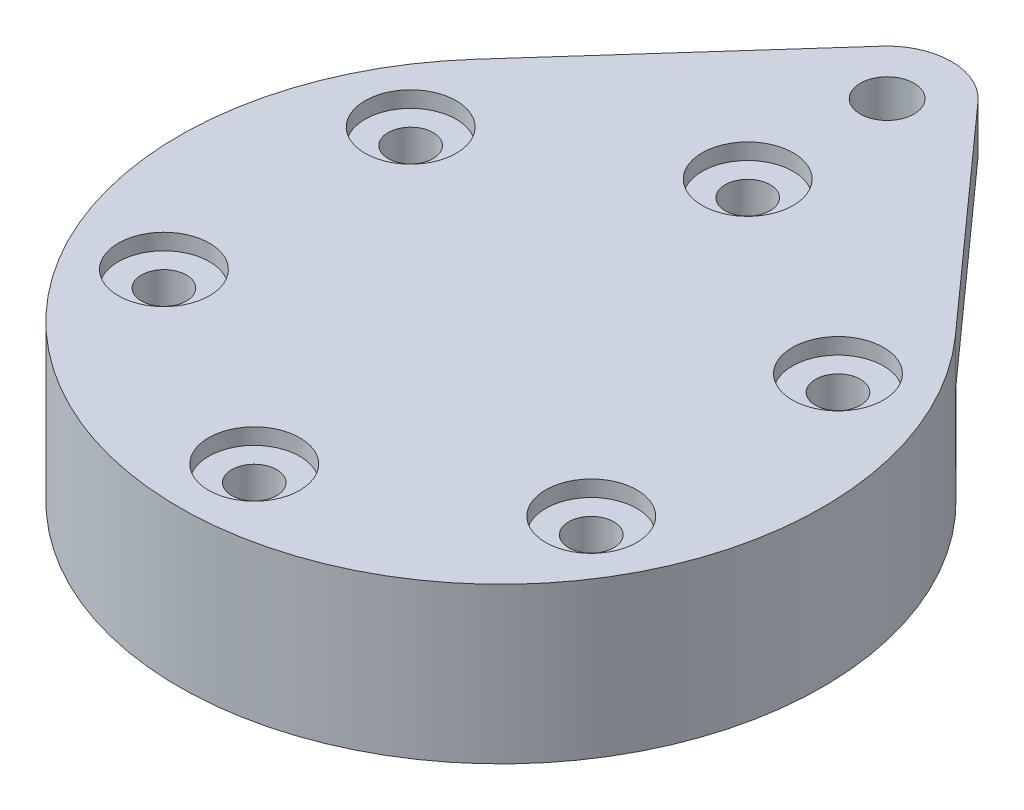
ISO-10303-21;
HEADER;
FILE_DESCRIPTION(('STEP AP214'),'2;1');
FILE_NAME('part.step','',(''),(''),'','','');
FILE_SCHEMA(('AUTOMOTIVE_DESIGN { 1 0 10303 214 1 1 1 1 }'));
ENDSEC;
DATA;
#1=APPLICATION_CONTEXT('core data for automotive mechanical design processes');
#2=APPLICATION_PROTOCOL_DEFINITION('international standard','automotive_design',2000,#1);
#3=PRODUCT_CONTEXT('',#1,'mechanical');
#4=PRODUCT('Part','Part','',(#3));
#5=PRODUCT_RELATED_PRODUCT_CATEGORY('part','',(#4));
#6=PRODUCT_DEFINITION_FORMATION('','',#4);
#7=PRODUCT_DEFINITION_CONTEXT('part definition',#1,'design');
#8=PRODUCT_DEFINITION('design','',#6,#7);
#9=PRODUCT_DEFINITION_SHAPE('','',#8);
#10=(LENGTH_UNIT() NAMED_UNIT(*) SI_UNIT(.MILLI.,.METRE.));
#11=(NAMED_UNIT(*) PLANE_ANGLE_UNIT() SI_UNIT($,.RADIAN.));
#12=(NAMED_UNIT(*) SI_UNIT($,.STERADIAN.) SOLID_ANGLE_UNIT());
#13=UNCERTAINTY_MEASURE_WITH_UNIT(LENGTH_MEASURE(1.E-05),#10,'distance_accuracy_value','');
#14=(GEOMETRIC_REPRESENTATION_CONTEXT(3) GLOBAL_UNCERTAINTY_ASSIGNED_CONTEXT((#13)) GLOBAL_UNIT_ASSIGNED_CONTEXT((#10,
#11,#12)) REPRESENTATION_CONTEXT('',''));
#15=CARTESIAN_POINT('',(0.,0.,0.));
#16=DIRECTION('',(0.,0.,1.));
#17=DIRECTION('',(1.,0.,0.));
#18=AXIS2_PLACEMENT_3D('',#15,#16,#17);
#19=CARTESIAN_POINT('',(0.,4.5,0.));
#20=DIRECTION('',(0.,-1.,0.));
#21=DIRECTION('',(0.,0.,-1.));
#22=AXIS2_PLACEMENT_3D('',#19,#20,#21);
#23=CYLINDRICAL_SURFACE('',#22,30.);
#24=DIRECTION('',(0.,-1.,0.));
#25=VECTOR('',#24,1.);
#26=CARTESIAN_POINT('',(-22.3606797749979,4.5,-20.));
#27=LINE('',#26,#25);
#28=CARTESIAN_POINT('',(-22.3606797749979,4.5,-20.));
#29=VERTEX_POINT('',#28);
#30=CARTESIAN_POINT('',(-22.3606797749979,0.,-20.));
#31=VERTEX_POINT('',#30);
#32=EDGE_CURVE('E101',#29,#31,#27,.T.);
#33=ORIENTED_EDGE('',*,*,#32,.T.);
#34=CARTESIAN_POINT('',(0.,0.,0.));
#35=DIRECTION('',(0.,-1.,0.));
#36=DIRECTION('',(0.,0.,-1.));
#37=AXIS2_PLACEMENT_3D('',#34,#35,#36);
#38=CIRCLE('',#37,30.);
#39=CARTESIAN_POINT('',(22.3606797749979,0.,-20.));
#40=VERTEX_POINT('',#39);
#41=EDGE_CURVE('E11',#31,#40,#38,.T.);
#42=ORIENTED_EDGE('',*,*,#41,.T.);
#43=DIRECTION('',(0.,-1.,0.));
#44=VECTOR('',#43,1.);
#45=CARTESIAN_POINT('',(22.3606797749979,4.5,-20.));
#46=LINE('',#45,#44);
#47=CARTESIAN_POINT('',(22.3606797749979,4.5,-20.));
#48=VERTEX_POINT('',#47);
#49=EDGE_CURVE('E47',#48,#40,#46,.T.);
#50=ORIENTED_EDGE('',*,*,#49,.F.);
#51=CARTESIAN_POINT('',(0.,4.5,0.));
#52=DIRECTION('',(0.,1.,0.));
#53=DIRECTION('',(0.,0.,1.));
#54=AXIS2_PLACEMENT_3D('',#51,#52,#53);
#55=CIRCLE('',#54,30.);
#56=EDGE_CURVE('E81',#29,#48,#55,.T.);
#57=ORIENTED_EDGE('',*,*,#56,.F.);
#58=EDGE_LOOP('',(#33,#42,#50,#57));
#59=FACE_BOUND('',#58,.T.);
#60=CARTESIAN_POINT('',(0.,-10.,0.));
#61=DIRECTION('',(0.,-1.,0.));
#62=DIRECTION('',(0.,0.,-1.));
#63=AXIS2_PLACEMENT_3D('',#60,#61,#62);
#64=CIRCLE('',#63,30.);
#65=CARTESIAN_POINT('',(0.,-10.,-30.));
#66=VERTEX_POINT('',#65);
#67=EDGE_CURVE('E146',#66,#66,#64,.T.);
#68=ORIENTED_EDGE('',*,*,#67,.F.);
#69=EDGE_LOOP('',(#68));
#70=FACE_BOUND('',#69,.T.);
#71=ADVANCED_FACE('F38',(#59,#70),#23,.T.);
#72=CARTESIAN_POINT('',(22.3606797749979,4.5,-20.));
#73=DIRECTION('',(0.745355992499929,0.,-0.666666666666667));
#74=DIRECTION('',(-0.666666666666667,0.,-0.74535599249993));
#75=AXIS2_PLACEMENT_3D('',#72,#73,#74);
#76=PLANE('',#75);
#77=DIRECTION('',(0.666666666666667,0.,0.74535599249993));
#78=VECTOR('',#77,1.);
#79=CARTESIAN_POINT('',(22.3606797749979,0.,-20.));
#80=LINE('',#79,#78);
#81=CARTESIAN_POINT('',(4.47213595499958,0.,-40.));
#82=VERTEX_POINT('',#81);
#83=EDGE_CURVE('E86',#82,#40,#80,.T.);
#84=ORIENTED_EDGE('',*,*,#83,.F.);
#85=DIRECTION('',(0.,-1.,0.));
#86=VECTOR('',#85,1.);
#87=CARTESIAN_POINT('',(4.47213595499958,4.5,-40.));
#88=LINE('',#87,#86);
#89=CARTESIAN_POINT('',(4.47213595499958,4.5,-40.));
#90=VERTEX_POINT('',#89);
#91=EDGE_CURVE('E97',#90,#82,#88,.T.);
#92=ORIENTED_EDGE('',*,*,#91,.F.);
#93=DIRECTION('',(0.666666666666667,0.,0.74535599249993));
#94=VECTOR('',#93,1.);
#95=CARTESIAN_POINT('',(22.3606797749979,4.5,-20.));
#96=LINE('',#95,#94);
#97=EDGE_CURVE('E95',#90,#48,#96,.T.);
#98=ORIENTED_EDGE('',*,*,#97,.T.);
#99=ORIENTED_EDGE('',*,*,#49,.T.);
#100=EDGE_LOOP('',(#84,#92,#98,#99));
#101=FACE_BOUND('',#100,.T.);
#102=ADVANCED_FACE('F94',(#101),#76,.T.);
#103=CARTESIAN_POINT('',(0.,4.5,-36.));
#104=DIRECTION('',(0.,-1.,0.));
#105=DIRECTION('',(0.,0.,-1.));
#106=AXIS2_PLACEMENT_3D('',#103,#104,#105);
#107=CYLINDRICAL_SURFACE('',#106,6.);
#108=CARTESIAN_POINT('',(0.,0.,-36.));
#109=DIRECTION('',(0.,1.,0.));
#110=DIRECTION('',(0.,0.,1.));
#111=AXIS2_PLACEMENT_3D('',#108,#109,#110);
#112=CIRCLE('',#111,6.);
#113=CARTESIAN_POINT('',(-4.47213595499958,0.,-40.));
#114=VERTEX_POINT('',#113);
#115=EDGE_CURVE('E70',#82,#114,#112,.T.);
#116=ORIENTED_EDGE('',*,*,#115,.T.);
#117=DIRECTION('',(0.,-1.,0.));
#118=VECTOR('',#117,1.);
#119=CARTESIAN_POINT('',(-4.47213595499958,4.5,-40.));
#120=LINE('',#119,#118);
#121=CARTESIAN_POINT('',(-4.47213595499958,4.5,-40.));
#122=VERTEX_POINT('',#121);
#123=EDGE_CURVE('E103',#122,#114,#120,.T.);
#124=ORIENTED_EDGE('',*,*,#123,.F.);
#125=CARTESIAN_POINT('',(0.,4.5,-36.));
#126=DIRECTION('',(0.,1.,0.));
#127=DIRECTION('',(0.,0.,1.));
#128=AXIS2_PLACEMENT_3D('',#125,#126,#127);
#129=CIRCLE('',#128,6.);
#130=EDGE_CURVE('E186',#90,#122,#129,.T.);
#131=ORIENTED_EDGE('',*,*,#130,.F.);
#132=ORIENTED_EDGE('',*,*,#91,.T.);
#133=EDGE_LOOP('',(#116,#124,#131,#132));
#134=FACE_BOUND('',#133,.T.);
#135=ADVANCED_FACE('F205',(#134),#107,.T.);
#136=CARTESIAN_POINT('',(-22.3606797749979,4.5,-20.));
#137=DIRECTION('',(0.745355992499929,0.,0.666666666666667));
#138=DIRECTION('',(0.666666666666667,0.,-0.74535599249993));
#139=AXIS2_PLACEMENT_3D('',#136,#137,#138);
#140=PLANE('',#139);
#141=DIRECTION('',(-0.666666666666667,0.,0.74535599249993));
#142=VECTOR('',#141,1.);
#143=CARTESIAN_POINT('',(-22.3606797749979,0.,-20.));
#144=LINE('',#143,#142);
#145=EDGE_CURVE('E189',#114,#31,#144,.T.);
#146=ORIENTED_EDGE('',*,*,#145,.T.);
#147=ORIENTED_EDGE('',*,*,#32,.F.);
#148=DIRECTION('',(-0.666666666666667,0.,0.74535599249993));
#149=VECTOR('',#148,1.);
#150=CARTESIAN_POINT('',(-22.3606797749979,4.5,-20.));
#151=LINE('',#150,#149);
#152=EDGE_CURVE('E56',#122,#29,#151,.T.);
#153=ORIENTED_EDGE('',*,*,#152,.F.);
#154=ORIENTED_EDGE('',*,*,#123,.T.);
#155=EDGE_LOOP('',(#146,#147,#153,#154));
#156=FACE_BOUND('',#155,.T.);
#157=ADVANCED_FACE('F196',(#156),#140,.F.);
#158=CARTESIAN_POINT('',(0.,4.5,-36.));
#159=DIRECTION('',(0.,-1.,0.));
#160=DIRECTION('',(0.,0.,-1.));
#161=AXIS2_PLACEMENT_3D('',#158,#159,#160);
#162=CYLINDRICAL_SURFACE('',#161,2.5);
#163=CARTESIAN_POINT('',(0.,4.5,-36.));
#164=DIRECTION('',(0.,1.,0.));
#165=DIRECTION('',(0.,0.,1.));
#166=AXIS2_PLACEMENT_3D('',#163,#164,#165);
#167=CIRCLE('',#166,2.5);
#168=CARTESIAN_POINT('',(0.,4.5,-33.5));
#169=VERTEX_POINT('',#168);
#170=EDGE_CURVE('E104',#169,#169,#167,.T.);
#171=ORIENTED_EDGE('',*,*,#170,.T.);
#172=EDGE_LOOP('',(#171));
#173=FACE_BOUND('',#172,.T.);
#174=CARTESIAN_POINT('',(0.,0.,-36.));
#175=DIRECTION('',(0.,1.,0.));
#176=DIRECTION('',(0.,0.,1.));
#177=AXIS2_PLACEMENT_3D('',#174,#175,#176);
#178=CIRCLE('',#177,2.5);
#179=CARTESIAN_POINT('',(0.,0.,-33.5));
#180=VERTEX_POINT('',#179);
#181=EDGE_CURVE('E110',#180,#180,#178,.T.);
#182=ORIENTED_EDGE('',*,*,#181,.F.);
#183=EDGE_LOOP('',(#182));
#184=FACE_BOUND('',#183,.T.);
#185=ADVANCED_FACE('F193',(#173,#184),#162,.F.);
#186=CARTESIAN_POINT('',(0.,4.5,0.));
#187=DIRECTION('',(0.,1.,0.));
#188=DIRECTION('',(0.,0.,1.));
#189=AXIS2_PLACEMENT_3D('',#186,#187,#188);
#190=PLANE('',#189);
#191=CARTESIAN_POINT('',(0.,4.5,-23.));
#192=DIRECTION('',(0.,1.,0.));
#193=DIRECTION('',(0.,0.,1.));
#194=AXIS2_PLACEMENT_3D('',#191,#192,#193);
#195=CIRCLE('',#194,4.25);
#196=CARTESIAN_POINT('',(0.,4.5,-18.75));
#197=VERTEX_POINT('',#196);
#198=EDGE_CURVE('E152',#197,#197,#195,.T.);
#199=ORIENTED_EDGE('',*,*,#198,.F.);
#200=EDGE_LOOP('',(#199));
#201=FACE_BOUND('',#200,.T.);
#202=CARTESIAN_POINT('',(-19.9185842870416,4.5,-11.4999999999991));
#203=DIRECTION('',(0.,1.,0.));
#204=DIRECTION('',(0.,0.,1.));
#205=AXIS2_PLACEMENT_3D('',#202,#203,#204);
#206=CIRCLE('',#205,4.25000000000099);
#207=CARTESIAN_POINT('',(-19.9185842870416,4.5,-7.24999999999815));
#208=VERTEX_POINT('',#207);
#209=EDGE_CURVE('E148',#208,#208,#206,.T.);
#210=ORIENTED_EDGE('',*,*,#209,.F.);
#211=EDGE_LOOP('',(#210));
#212=FACE_BOUND('',#211,.T.);
#213=CARTESIAN_POINT('',(-19.9185842870406,4.5,11.5000000000009));
#214=DIRECTION('',(0.,1.,0.));
#215=DIRECTION('',(0.,0.,1.));
#216=AXIS2_PLACEMENT_3D('',#213,#214,#215);
#217=CIRCLE('',#216,4.25000000000186);
#218=CARTESIAN_POINT('',(-19.9185842870406,4.5,15.7500000000027));
#219=VERTEX_POINT('',#218);
#220=EDGE_CURVE('E159',#219,#219,#217,.T.);
#221=ORIENTED_EDGE('',*,*,#220,.F.);
#222=EDGE_LOOP('',(#221));
#223=FACE_BOUND('',#222,.T.);
#224=CARTESIAN_POINT('',(1.95264788778376E-12,4.5,23.));
#225=DIRECTION('',(0.,1.,0.));
#226=DIRECTION('',(0.,0.,1.));
#227=AXIS2_PLACEMENT_3D('',#224,#225,#226);
#228=CIRCLE('',#227,4.25000000000202);
#229=CARTESIAN_POINT('',(1.95264788778376E-12,4.5,27.250000000002));
#230=VERTEX_POINT('',#229);
#231=EDGE_CURVE('E176',#230,#230,#228,.T.);
#232=ORIENTED_EDGE('',*,*,#231,.F.);
#233=EDGE_LOOP('',(#232));
#234=FACE_BOUND('',#233,.T.);
#235=CARTESIAN_POINT('',(19.9185842870436,4.5,11.4999999999992));
#236=DIRECTION('',(0.,1.,0.));
#237=DIRECTION('',(0.,0.,1.));
#238=AXIS2_PLACEMENT_3D('',#235,#236,#237);
#239=CIRCLE('',#238,4.25000000000126);
#240=CARTESIAN_POINT('',(19.9185842870436,4.5,15.7500000000004));
#241=VERTEX_POINT('',#240);
#242=EDGE_CURVE('E170',#241,#241,#239,.T.);
#243=ORIENTED_EDGE('',*,*,#242,.F.);
#244=EDGE_LOOP('',(#243));
#245=FACE_BOUND('',#244,.T.);
#246=CARTESIAN_POINT('',(19.9185842870426,4.5,-11.5000000000008));
#247=DIRECTION('',(0.,1.,0.));
#248=DIRECTION('',(0.,0.,1.));
#249=AXIS2_PLACEMENT_3D('',#246,#247,#248);
#250=CIRCLE('',#249,4.25000000000028);
#251=CARTESIAN_POINT('',(19.9185842870426,4.5,-7.25000000000057));
#252=VERTEX_POINT('',#251);
#253=EDGE_CURVE('E164',#252,#252,#250,.T.);
#254=ORIENTED_EDGE('',*,*,#253,.F.);
#255=EDGE_LOOP('',(#254));
#256=FACE_BOUND('',#255,.T.);
#257=ORIENTED_EDGE('',*,*,#56,.T.);
#258=ORIENTED_EDGE('',*,*,#97,.F.);
#259=ORIENTED_EDGE('',*,*,#130,.T.);
#260=ORIENTED_EDGE('',*,*,#152,.T.);
#261=EDGE_LOOP('',(#257,#258,#259,#260));
#262=FACE_BOUND('',#261,.T.);
#263=ORIENTED_EDGE('',*,*,#170,.F.);
#264=EDGE_LOOP('',(#263));
#265=FACE_BOUND('',#264,.T.);
#266=ADVANCED_FACE('F195',(#201,#212,#223,#234,#245,#256,#262,#265),#190,.T.);
#267=CARTESIAN_POINT('',(0.,0.,0.));
#268=DIRECTION('',(0.,1.,0.));
#269=DIRECTION('',(0.,0.,1.));
#270=AXIS2_PLACEMENT_3D('',#267,#268,#269);
#271=PLANE('',#270);
#272=ORIENTED_EDGE('',*,*,#41,.F.);
#273=ORIENTED_EDGE('',*,*,#145,.F.);
#274=ORIENTED_EDGE('',*,*,#115,.F.);
#275=ORIENTED_EDGE('',*,*,#83,.T.);
#276=EDGE_LOOP('',(#272,#273,#274,#275));
#277=FACE_BOUND('',#276,.T.);
#278=ORIENTED_EDGE('',*,*,#181,.T.);
#279=EDGE_LOOP('',(#278));
#280=FACE_BOUND('',#279,.T.);
#281=ADVANCED_FACE('F88',(#277,#280),#271,.F.);
#282=CARTESIAN_POINT('',(19.9185842870426,3.,-11.5000000000008));
#283=DIRECTION('',(0.,1.,0.));
#284=DIRECTION('',(0.,0.,1.));
#285=AXIS2_PLACEMENT_3D('',#282,#283,#284);
#286=CYLINDRICAL_SURFACE('',#285,4.25000000000028);
#287=CARTESIAN_POINT('',(19.9185842870426,3.,-11.5000000000008));
#288=DIRECTION('',(0.,1.,0.));
#289=DIRECTION('',(0.,0.,1.));
#290=AXIS2_PLACEMENT_3D('',#287,#288,#289);
#291=CIRCLE('',#290,4.25000000000028);
#292=CARTESIAN_POINT('',(19.9185842870426,3.,-7.25000000000057));
#293=VERTEX_POINT('',#292);
#294=EDGE_CURVE('E155',#293,#293,#291,.T.);
#295=ORIENTED_EDGE('',*,*,#294,.F.);
#296=EDGE_LOOP('',(#295));
#297=FACE_BOUND('',#296,.T.);
#298=ORIENTED_EDGE('',*,*,#253,.T.);
#299=EDGE_LOOP('',(#298));
#300=FACE_BOUND('',#299,.T.);
#301=ADVANCED_FACE('F235',(#297,#300),#286,.F.);
#302=CARTESIAN_POINT('',(19.9185842870426,3.,-11.5000000000008));
#303=DIRECTION('',(0.,1.,0.));
#304=DIRECTION('',(0.,0.,1.));
#305=AXIS2_PLACEMENT_3D('',#302,#303,#304);
#306=PLANE('',#305);
#307=CARTESIAN_POINT('',(19.9185842870426,3.,-11.5000000000008));
#308=DIRECTION('',(0.,1.,0.));
#309=DIRECTION('',(0.,0.,1.));
#310=AXIS2_PLACEMENT_3D('',#307,#308,#309);
#311=CIRCLE('',#310,2.10000000000027);
#312=CARTESIAN_POINT('',(19.9185842870426,3.,-9.40000000000058));
#313=VERTEX_POINT('',#312);
#314=EDGE_CURVE('E117',#313,#313,#311,.T.);
#315=ORIENTED_EDGE('',*,*,#314,.F.);
#316=EDGE_LOOP('',(#315));
#317=FACE_BOUND('',#316,.T.);
#318=ORIENTED_EDGE('',*,*,#294,.T.);
#319=EDGE_LOOP('',(#318));
#320=FACE_BOUND('',#319,.T.);
#321=ADVANCED_FACE('F242',(#317,#320),#306,.T.);
#322=CARTESIAN_POINT('',(19.9185842870436,3.,11.4999999999992));
#323=DIRECTION('',(0.,1.,0.));
#324=DIRECTION('',(0.,0.,1.));
#325=AXIS2_PLACEMENT_3D('',#322,#323,#324);
#326=CYLINDRICAL_SURFACE('',#325,4.25000000000126);
#327=CARTESIAN_POINT('',(19.9185842870436,3.,11.4999999999992));
#328=DIRECTION('',(0.,1.,0.));
#329=DIRECTION('',(0.,0.,1.));
#330=AXIS2_PLACEMENT_3D('',#327,#328,#329);
#331=CIRCLE('',#330,4.25000000000126);
#332=CARTESIAN_POINT('',(19.9185842870436,3.,15.7500000000004));
#333=VERTEX_POINT('',#332);
#334=EDGE_CURVE('E167',#333,#333,#331,.T.);
#335=ORIENTED_EDGE('',*,*,#334,.F.);
#336=EDGE_LOOP('',(#335));
#337=FACE_BOUND('',#336,.T.);
#338=ORIENTED_EDGE('',*,*,#242,.T.);
#339=EDGE_LOOP('',(#338));
#340=FACE_BOUND('',#339,.T.);
#341=ADVANCED_FACE('F247',(#337,#340),#326,.F.);
#342=CARTESIAN_POINT('',(19.9185842870436,3.,11.4999999999992));
#343=DIRECTION('',(0.,1.,0.));
#344=DIRECTION('',(0.,0.,1.));
#345=AXIS2_PLACEMENT_3D('',#342,#343,#344);
#346=PLANE('',#345);
#347=CARTESIAN_POINT('',(19.9185842870436,3.,11.4999999999992));
#348=DIRECTION('',(0.,1.,0.));
#349=DIRECTION('',(0.,0.,1.));
#350=AXIS2_PLACEMENT_3D('',#347,#348,#349);
#351=CIRCLE('',#350,2.10000000000126);
#352=CARTESIAN_POINT('',(19.9185842870436,3.,13.6000000000004));
#353=VERTEX_POINT('',#352);
#354=EDGE_CURVE('E121',#353,#353,#351,.T.);
#355=ORIENTED_EDGE('',*,*,#354,.F.);
#356=EDGE_LOOP('',(#355));
#357=FACE_BOUND('',#356,.T.);
#358=ORIENTED_EDGE('',*,*,#334,.T.);
#359=EDGE_LOOP('',(#358));
#360=FACE_BOUND('',#359,.T.);
#361=ADVANCED_FACE('F255',(#357,#360),#346,.T.);
#362=CARTESIAN_POINT('',(1.95264788778376E-12,3.,23.));
#363=DIRECTION('',(0.,1.,0.));
#364=DIRECTION('',(0.,0.,1.));
#365=AXIS2_PLACEMENT_3D('',#362,#363,#364);
#366=CYLINDRICAL_SURFACE('',#365,4.25000000000202);
#367=CARTESIAN_POINT('',(1.95264788778376E-12,3.,23.));
#368=DIRECTION('',(0.,1.,0.));
#369=DIRECTION('',(0.,0.,1.));
#370=AXIS2_PLACEMENT_3D('',#367,#368,#369);
#371=CIRCLE('',#370,4.25000000000202);
#372=CARTESIAN_POINT('',(1.95264788778376E-12,3.,27.250000000002));
#373=VERTEX_POINT('',#372);
#374=EDGE_CURVE('E173',#373,#373,#371,.T.);
#375=ORIENTED_EDGE('',*,*,#374,.F.);
#376=EDGE_LOOP('',(#375));
#377=FACE_BOUND('',#376,.T.);
#378=ORIENTED_EDGE('',*,*,#231,.T.);
#379=EDGE_LOOP('',(#378));
#380=FACE_BOUND('',#379,.T.);
#381=ADVANCED_FACE('F260',(#377,#380),#366,.F.);
#382=CARTESIAN_POINT('',(1.95264788778376E-12,3.,23.));
#383=DIRECTION('',(0.,1.,0.));
#384=DIRECTION('',(0.,0.,1.));
#385=AXIS2_PLACEMENT_3D('',#382,#383,#384);
#386=PLANE('',#385);
#387=CARTESIAN_POINT('',(1.95264788778376E-12,3.,23.));
#388=DIRECTION('',(0.,1.,0.));
#389=DIRECTION('',(0.,0.,1.));
#390=AXIS2_PLACEMENT_3D('',#387,#388,#389);
#391=CIRCLE('',#390,2.10000000000202);
#392=CARTESIAN_POINT('',(1.95264788778376E-12,3.,25.100000000002));
#393=VERTEX_POINT('',#392);
#394=EDGE_CURVE('E125',#393,#393,#391,.T.);
#395=ORIENTED_EDGE('',*,*,#394,.F.);
#396=EDGE_LOOP('',(#395));
#397=FACE_BOUND('',#396,.T.);
#398=ORIENTED_EDGE('',*,*,#374,.T.);
#399=EDGE_LOOP('',(#398));
#400=FACE_BOUND('',#399,.T.);
#401=ADVANCED_FACE('F268',(#397,#400),#386,.T.);
#402=CARTESIAN_POINT('',(-19.9185842870406,3.,11.5000000000009));
#403=DIRECTION('',(0.,1.,0.));
#404=DIRECTION('',(0.,0.,1.));
#405=AXIS2_PLACEMENT_3D('',#402,#403,#404);
#406=CYLINDRICAL_SURFACE('',#405,4.25000000000186);
#407=CARTESIAN_POINT('',(-19.9185842870406,3.,11.5000000000009));
#408=DIRECTION('',(0.,1.,0.));
#409=DIRECTION('',(0.,0.,1.));
#410=AXIS2_PLACEMENT_3D('',#407,#408,#409);
#411=CIRCLE('',#410,4.25000000000186);
#412=CARTESIAN_POINT('',(-19.9185842870406,3.,15.7500000000027));
#413=VERTEX_POINT('',#412);
#414=EDGE_CURVE('E179',#413,#413,#411,.T.);
#415=ORIENTED_EDGE('',*,*,#414,.F.);
#416=EDGE_LOOP('',(#415));
#417=FACE_BOUND('',#416,.T.);
#418=ORIENTED_EDGE('',*,*,#220,.T.);
#419=EDGE_LOOP('',(#418));
#420=FACE_BOUND('',#419,.T.);
#421=ADVANCED_FACE('F273',(#417,#420),#406,.F.);
#422=CARTESIAN_POINT('',(-19.9185842870406,3.,11.5000000000009));
#423=DIRECTION('',(0.,1.,0.));
#424=DIRECTION('',(0.,0.,1.));
#425=AXIS2_PLACEMENT_3D('',#422,#423,#424);
#426=PLANE('',#425);
#427=CARTESIAN_POINT('',(-19.9185842870406,3.,11.5000000000009));
#428=DIRECTION('',(0.,1.,0.));
#429=DIRECTION('',(0.,0.,1.));
#430=AXIS2_PLACEMENT_3D('',#427,#428,#429);
#431=CIRCLE('',#430,2.10000000000186);
#432=CARTESIAN_POINT('',(-19.9185842870406,3.,13.6000000000027));
#433=VERTEX_POINT('',#432);
#434=EDGE_CURVE('E128',#433,#433,#431,.T.);
#435=ORIENTED_EDGE('',*,*,#434,.F.);
#436=EDGE_LOOP('',(#435));
#437=FACE_BOUND('',#436,.T.);
#438=ORIENTED_EDGE('',*,*,#414,.T.);
#439=EDGE_LOOP('',(#438));
#440=FACE_BOUND('',#439,.T.);
#441=ADVANCED_FACE('F281',(#437,#440),#426,.T.);
#442=CARTESIAN_POINT('',(-19.9185842870416,3.,-11.4999999999991));
#443=DIRECTION('',(0.,1.,0.));
#444=DIRECTION('',(0.,0.,1.));
#445=AXIS2_PLACEMENT_3D('',#442,#443,#444);
#446=CYLINDRICAL_SURFACE('',#445,4.25000000000099);
#447=CARTESIAN_POINT('',(-19.9185842870416,3.,-11.4999999999991));
#448=DIRECTION('',(0.,1.,0.));
#449=DIRECTION('',(0.,0.,1.));
#450=AXIS2_PLACEMENT_3D('',#447,#448,#449);
#451=CIRCLE('',#450,4.25000000000099);
#452=CARTESIAN_POINT('',(-19.9185842870416,3.,-7.24999999999815));
#453=VERTEX_POINT('',#452);
#454=EDGE_CURVE('E156',#453,#453,#451,.T.);
#455=ORIENTED_EDGE('',*,*,#454,.F.);
#456=EDGE_LOOP('',(#455));
#457=FACE_BOUND('',#456,.T.);
#458=ORIENTED_EDGE('',*,*,#209,.T.);
#459=EDGE_LOOP('',(#458));
#460=FACE_BOUND('',#459,.T.);
#461=ADVANCED_FACE('F286',(#457,#460),#446,.F.);
#462=CARTESIAN_POINT('',(-19.9185842870416,3.,-11.4999999999991));
#463=DIRECTION('',(0.,1.,0.));
#464=DIRECTION('',(0.,0.,1.));
#465=AXIS2_PLACEMENT_3D('',#462,#463,#464);
#466=PLANE('',#465);
#467=CARTESIAN_POINT('',(-19.9185842870416,3.,-11.4999999999991));
#468=DIRECTION('',(0.,1.,0.));
#469=DIRECTION('',(0.,0.,1.));
#470=AXIS2_PLACEMENT_3D('',#467,#468,#469);
#471=CIRCLE('',#470,2.10000000000099);
#472=CARTESIAN_POINT('',(-19.9185842870416,3.,-9.39999999999815));
#473=VERTEX_POINT('',#472);
#474=EDGE_CURVE('E131',#473,#473,#471,.T.);
#475=ORIENTED_EDGE('',*,*,#474,.F.);
#476=EDGE_LOOP('',(#475));
#477=FACE_BOUND('',#476,.T.);
#478=ORIENTED_EDGE('',*,*,#454,.T.);
#479=EDGE_LOOP('',(#478));
#480=FACE_BOUND('',#479,.T.);
#481=ADVANCED_FACE('F294',(#477,#480),#466,.T.);
#482=CARTESIAN_POINT('',(0.,3.,-23.));
#483=DIRECTION('',(0.,1.,0.));
#484=DIRECTION('',(0.,0.,1.));
#485=AXIS2_PLACEMENT_3D('',#482,#483,#484);
#486=CYLINDRICAL_SURFACE('',#485,4.25);
#487=CARTESIAN_POINT('',(0.,3.,-23.));
#488=DIRECTION('',(0.,1.,0.));
#489=DIRECTION('',(0.,0.,1.));
#490=AXIS2_PLACEMENT_3D('',#487,#488,#489);
#491=CIRCLE('',#490,4.25);
#492=CARTESIAN_POINT('',(0.,3.,-18.75));
#493=VERTEX_POINT('',#492);
#494=EDGE_CURVE('E91',#493,#493,#491,.T.);
#495=ORIENTED_EDGE('',*,*,#494,.F.);
#496=EDGE_LOOP('',(#495));
#497=FACE_BOUND('',#496,.T.);
#498=ORIENTED_EDGE('',*,*,#198,.T.);
#499=EDGE_LOOP('',(#498));
#500=FACE_BOUND('',#499,.T.);
#501=ADVANCED_FACE('F299',(#497,#500),#486,.F.);
#502=CARTESIAN_POINT('',(0.,3.,-23.));
#503=DIRECTION('',(0.,1.,0.));
#504=DIRECTION('',(0.,0.,1.));
#505=AXIS2_PLACEMENT_3D('',#502,#503,#504);
#506=PLANE('',#505);
#507=CARTESIAN_POINT('',(0.,3.,-23.));
#508=DIRECTION('',(0.,1.,0.));
#509=DIRECTION('',(0.,0.,1.));
#510=AXIS2_PLACEMENT_3D('',#507,#508,#509);
#511=CIRCLE('',#510,2.1);
#512=CARTESIAN_POINT('',(0.,3.,-20.9));
#513=VERTEX_POINT('',#512);
#514=EDGE_CURVE('E143',#513,#513,#511,.T.);
#515=ORIENTED_EDGE('',*,*,#514,.F.);
#516=EDGE_LOOP('',(#515));
#517=FACE_BOUND('',#516,.T.);
#518=ORIENTED_EDGE('',*,*,#494,.T.);
#519=EDGE_LOOP('',(#518));
#520=FACE_BOUND('',#519,.T.);
#521=ADVANCED_FACE('F307',(#517,#520),#506,.T.);
#522=CARTESIAN_POINT('',(0.,-10.,0.));
#523=DIRECTION('',(0.,-1.,0.));
#524=DIRECTION('',(0.,0.,-1.));
#525=AXIS2_PLACEMENT_3D('',#522,#523,#524);
#526=PLANE('',#525);
#527=CARTESIAN_POINT('',(0.,-10.,-23.));
#528=DIRECTION('',(0.,-1.,0.));
#529=DIRECTION('',(0.,0.,-1.));
#530=AXIS2_PLACEMENT_3D('',#527,#528,#529);
#531=CIRCLE('',#530,2.1);
#532=CARTESIAN_POINT('',(0.,-10.,-25.1));
#533=VERTEX_POINT('',#532);
#534=EDGE_CURVE('E41',#533,#533,#531,.T.);
#535=ORIENTED_EDGE('',*,*,#534,.F.);
#536=EDGE_LOOP('',(#535));
#537=FACE_BOUND('',#536,.T.);
#538=CARTESIAN_POINT('',(-19.9185842870416,-10.,-11.4999999999991));
#539=DIRECTION('',(0.,-1.,0.));
#540=DIRECTION('',(0.,0.,-1.));
#541=AXIS2_PLACEMENT_3D('',#538,#539,#540);
#542=CIRCLE('',#541,2.10000000000099);
#543=CARTESIAN_POINT('',(-19.9185842870416,-10.,-13.6000000000001));
#544=VERTEX_POINT('',#543);
#545=EDGE_CURVE('E129',#544,#544,#542,.T.);
#546=ORIENTED_EDGE('',*,*,#545,.F.);
#547=EDGE_LOOP('',(#546));
#548=FACE_BOUND('',#547,.T.);
#549=CARTESIAN_POINT('',(-19.9185842870406,-10.,11.5000000000009));
#550=DIRECTION('',(0.,-1.,0.));
#551=DIRECTION('',(0.,0.,-1.));
#552=AXIS2_PLACEMENT_3D('',#549,#550,#551);
#553=CIRCLE('',#552,2.10000000000186);
#554=CARTESIAN_POINT('',(-19.9185842870406,-10.,9.399999999999));
#555=VERTEX_POINT('',#554);
#556=EDGE_CURVE('E126',#555,#555,#553,.T.);
#557=ORIENTED_EDGE('',*,*,#556,.F.);
#558=EDGE_LOOP('',(#557));
#559=FACE_BOUND('',#558,.T.);
#560=CARTESIAN_POINT('',(1.95264788778376E-12,-10.,23.));
#561=DIRECTION('',(0.,-1.,0.));
#562=DIRECTION('',(0.,0.,-1.));
#563=AXIS2_PLACEMENT_3D('',#560,#561,#562);
#564=CIRCLE('',#563,2.10000000000202);
#565=CARTESIAN_POINT('',(1.95264788778376E-12,-10.,20.899999999998));
#566=VERTEX_POINT('',#565);
#567=EDGE_CURVE('E122',#566,#566,#564,.T.);
#568=ORIENTED_EDGE('',*,*,#567,.F.);
#569=EDGE_LOOP('',(#568));
#570=FACE_BOUND('',#569,.T.);
#571=CARTESIAN_POINT('',(19.9185842870436,-10.,11.4999999999992));
#572=DIRECTION('',(0.,-1.,0.));
#573=DIRECTION('',(0.,0.,-1.));
#574=AXIS2_PLACEMENT_3D('',#571,#572,#573);
#575=CIRCLE('',#574,2.10000000000126);
#576=CARTESIAN_POINT('',(19.9185842870436,-10.,9.39999999999789));
#577=VERTEX_POINT('',#576);
#578=EDGE_CURVE('E118',#577,#577,#575,.T.);
#579=ORIENTED_EDGE('',*,*,#578,.F.);
#580=EDGE_LOOP('',(#579));
#581=FACE_BOUND('',#580,.T.);
#582=CARTESIAN_POINT('',(19.9185842870426,-10.,-11.5000000000008));
#583=DIRECTION('',(0.,-1.,0.));
#584=DIRECTION('',(0.,0.,-1.));
#585=AXIS2_PLACEMENT_3D('',#582,#583,#584);
#586=CIRCLE('',#585,2.10000000000027);
#587=CARTESIAN_POINT('',(19.9185842870426,-10.,-13.6000000000011));
#588=VERTEX_POINT('',#587);
#589=EDGE_CURVE('E114',#588,#588,#586,.T.);
#590=ORIENTED_EDGE('',*,*,#589,.F.);
#591=EDGE_LOOP('',(#590));
#592=FACE_BOUND('',#591,.T.);
#593=ORIENTED_EDGE('',*,*,#67,.T.);
#594=EDGE_LOOP('',(#593));
#595=FACE_BOUND('',#594,.T.);
#596=ADVANCED_FACE('F312',(#537,#548,#559,#570,#581,#592,#595),#526,.T.);
#597=CARTESIAN_POINT('',(19.9185842870426,-38.5,-11.5000000000008));
#598=DIRECTION('',(0.,1.,0.));
#599=DIRECTION('',(0.,0.,1.));
#600=AXIS2_PLACEMENT_3D('',#597,#598,#599);
#601=CYLINDRICAL_SURFACE('',#600,2.10000000000027);
#602=ORIENTED_EDGE('',*,*,#314,.T.);
#603=EDGE_LOOP('',(#602));
#604=FACE_BOUND('',#603,.T.);
#605=ORIENTED_EDGE('',*,*,#589,.T.);
#606=EDGE_LOOP('',(#605));
#607=FACE_BOUND('',#606,.T.);
#608=ADVANCED_FACE('F322',(#604,#607),#601,.F.);
#609=CARTESIAN_POINT('',(19.9185842870436,-38.5,11.4999999999992));
#610=DIRECTION('',(0.,1.,0.));
#611=DIRECTION('',(0.,0.,1.));
#612=AXIS2_PLACEMENT_3D('',#609,#610,#611);
#613=CYLINDRICAL_SURFACE('',#612,2.10000000000126);
#614=ORIENTED_EDGE('',*,*,#354,.T.);
#615=EDGE_LOOP('',(#614));
#616=FACE_BOUND('',#615,.T.);
#617=ORIENTED_EDGE('',*,*,#578,.T.);
#618=EDGE_LOOP('',(#617));
#619=FACE_BOUND('',#618,.T.);
#620=ADVANCED_FACE('F332',(#616,#619),#613,.F.);
#621=CARTESIAN_POINT('',(1.95264788778376E-12,-38.5,23.));
#622=DIRECTION('',(0.,1.,0.));
#623=DIRECTION('',(0.,0.,1.));
#624=AXIS2_PLACEMENT_3D('',#621,#622,#623);
#625=CYLINDRICAL_SURFACE('',#624,2.10000000000202);
#626=ORIENTED_EDGE('',*,*,#394,.T.);
#627=EDGE_LOOP('',(#626));
#628=FACE_BOUND('',#627,.T.);
#629=ORIENTED_EDGE('',*,*,#567,.T.);
#630=EDGE_LOOP('',(#629));
#631=FACE_BOUND('',#630,.T.);
#632=ADVANCED_FACE('F342',(#628,#631),#625,.F.);
#633=CARTESIAN_POINT('',(-19.9185842870406,-38.5,11.5000000000009));
#634=DIRECTION('',(0.,1.,0.));
#635=DIRECTION('',(0.,0.,1.));
#636=AXIS2_PLACEMENT_3D('',#633,#634,#635);
#637=CYLINDRICAL_SURFACE('',#636,2.10000000000186);
#638=ORIENTED_EDGE('',*,*,#434,.T.);
#639=EDGE_LOOP('',(#638));
#640=FACE_BOUND('',#639,.T.);
#641=ORIENTED_EDGE('',*,*,#556,.T.);
#642=EDGE_LOOP('',(#641));
#643=FACE_BOUND('',#642,.T.);
#644=ADVANCED_FACE('F352',(#640,#643),#637,.F.);
#645=CARTESIAN_POINT('',(-19.9185842870416,-38.5,-11.4999999999991));
#646=DIRECTION('',(0.,1.,0.));
#647=DIRECTION('',(0.,0.,1.));
#648=AXIS2_PLACEMENT_3D('',#645,#646,#647);
#649=CYLINDRICAL_SURFACE('',#648,2.10000000000099);
#650=ORIENTED_EDGE('',*,*,#474,.T.);
#651=EDGE_LOOP('',(#650));
#652=FACE_BOUND('',#651,.T.);
#653=ORIENTED_EDGE('',*,*,#545,.T.);
#654=EDGE_LOOP('',(#653));
#655=FACE_BOUND('',#654,.T.);
#656=ADVANCED_FACE('F362',(#652,#655),#649,.F.);
#657=CARTESIAN_POINT('',(0.,-38.5,-23.));
#658=DIRECTION('',(0.,1.,0.));
#659=DIRECTION('',(0.,0.,1.));
#660=AXIS2_PLACEMENT_3D('',#657,#658,#659);
#661=CYLINDRICAL_SURFACE('',#660,2.1);
#662=ORIENTED_EDGE('',*,*,#514,.T.);
#663=EDGE_LOOP('',(#662));
#664=FACE_BOUND('',#663,.T.);
#665=ORIENTED_EDGE('',*,*,#534,.T.);
#666=EDGE_LOOP('',(#665));
#667=FACE_BOUND('',#666,.T.);
#668=ADVANCED_FACE('F371',(#664,#667),#661,.F.);
#669=CLOSED_SHELL('',(#71,#102,#135,#157,#185,#266,#281,#301,#321,#341,#361,#381,#401,#421,#441,
#461,#481,#501,#521,#596,#608,#620,#632,#644,#656,#668));
#670=MANIFOLD_SOLID_BREP('B2',#669);
#671=ADVANCED_BREP_SHAPE_REPRESENTATION('',(#18,#670),#14);
#672=SHAPE_DEFINITION_REPRESENTATION(#9,#671);
ENDSEC;
END-ISO-10303-21;
